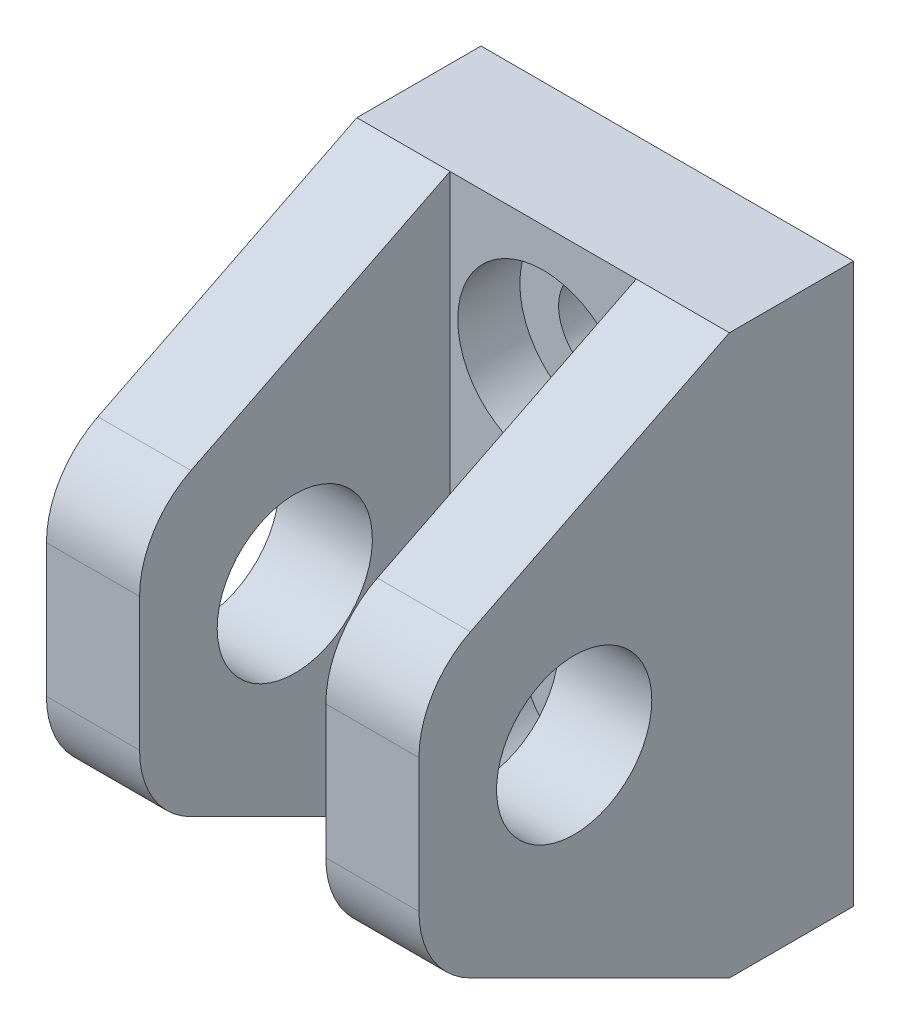
ISO-10303-21;
HEADER;
FILE_DESCRIPTION(('STEP AP214'),'2;1');
FILE_NAME('part.step','',(''),(''),'','','');
FILE_SCHEMA(('AUTOMOTIVE_DESIGN { 1 0 10303 214 1 1 1 1 }'));
ENDSEC;
DATA;
#1=APPLICATION_CONTEXT('core data for automotive mechanical design processes');
#2=APPLICATION_PROTOCOL_DEFINITION('international standard','automotive_design',2000,#1);
#3=PRODUCT_CONTEXT('',#1,'mechanical');
#4=PRODUCT('Part','Part','',(#3));
#5=PRODUCT_RELATED_PRODUCT_CATEGORY('part','',(#4));
#6=PRODUCT_DEFINITION_FORMATION('','',#4);
#7=PRODUCT_DEFINITION_CONTEXT('part definition',#1,'design');
#8=PRODUCT_DEFINITION('design','',#6,#7);
#9=PRODUCT_DEFINITION_SHAPE('','',#8);
#10=(LENGTH_UNIT() NAMED_UNIT(*) SI_UNIT(.MILLI.,.METRE.));
#11=(NAMED_UNIT(*) PLANE_ANGLE_UNIT() SI_UNIT($,.RADIAN.));
#12=(NAMED_UNIT(*) SI_UNIT($,.STERADIAN.) SOLID_ANGLE_UNIT());
#13=UNCERTAINTY_MEASURE_WITH_UNIT(LENGTH_MEASURE(1.E-05),#10,'distance_accuracy_value','');
#14=(GEOMETRIC_REPRESENTATION_CONTEXT(3) GLOBAL_UNCERTAINTY_ASSIGNED_CONTEXT((#13)) GLOBAL_UNIT_ASSIGNED_CONTEXT((#10,
#11,#12)) REPRESENTATION_CONTEXT('',''));
#15=CARTESIAN_POINT('',(0.,0.,0.));
#16=DIRECTION('',(0.,0.,1.));
#17=DIRECTION('',(1.,0.,0.));
#18=AXIS2_PLACEMENT_3D('',#15,#16,#17);
#19=CARTESIAN_POINT('',(10.,4.,0.));
#20=DIRECTION('',(0.,0.,1.));
#21=DIRECTION('',(1.,0.,0.));
#22=AXIS2_PLACEMENT_3D('',#19,#20,#21);
#23=CYLINDRICAL_SURFACE('',#22,1.5);
#24=CARTESIAN_POINT('',(10.,4.,0.));
#25=DIRECTION('',(0.,0.,1.));
#26=DIRECTION('',(1.,0.,0.));
#27=AXIS2_PLACEMENT_3D('',#24,#25,#26);
#28=CIRCLE('',#27,1.5);
#29=CARTESIAN_POINT('',(11.5,4.,0.));
#30=VERTEX_POINT('',#29);
#31=EDGE_CURVE('E208',#30,#30,#28,.T.);
#32=ORIENTED_EDGE('',*,*,#31,.F.);
#33=EDGE_LOOP('',(#32));
#34=FACE_BOUND('',#33,.T.);
#35=CARTESIAN_POINT('',(10.,4.,2.));
#36=DIRECTION('',(0.,0.,1.));
#37=DIRECTION('',(1.,0.,0.));
#38=AXIS2_PLACEMENT_3D('',#35,#36,#37);
#39=CIRCLE('',#38,1.5);
#40=CARTESIAN_POINT('',(11.5,4.,2.));
#41=VERTEX_POINT('',#40);
#42=EDGE_CURVE('E38',#41,#41,#39,.F.);
#43=ORIENTED_EDGE('',*,*,#42,.F.);
#44=EDGE_LOOP('',(#43));
#45=FACE_BOUND('',#44,.T.);
#46=ADVANCED_FACE('F34',(#34,#45),#23,.F.);
#47=CARTESIAN_POINT('',(10.,14.,0.));
#48=DIRECTION('',(0.,0.,1.));
#49=DIRECTION('',(1.,0.,0.));
#50=AXIS2_PLACEMENT_3D('',#47,#48,#49);
#51=CYLINDRICAL_SURFACE('',#50,1.5);
#52=CARTESIAN_POINT('',(10.,14.,0.));
#53=DIRECTION('',(0.,0.,1.));
#54=DIRECTION('',(1.,0.,0.));
#55=AXIS2_PLACEMENT_3D('',#52,#53,#54);
#56=CIRCLE('',#55,1.5);
#57=CARTESIAN_POINT('',(11.5,14.,0.));
#58=VERTEX_POINT('',#57);
#59=EDGE_CURVE('E148',#58,#58,#56,.T.);
#60=ORIENTED_EDGE('',*,*,#59,.F.);
#61=EDGE_LOOP('',(#60));
#62=FACE_BOUND('',#61,.T.);
#63=CARTESIAN_POINT('',(10.,14.,2.));
#64=DIRECTION('',(0.,0.,1.));
#65=DIRECTION('',(1.,0.,0.));
#66=AXIS2_PLACEMENT_3D('',#63,#64,#65);
#67=CIRCLE('',#66,1.5);
#68=CARTESIAN_POINT('',(11.5,14.,2.));
#69=VERTEX_POINT('',#68);
#70=EDGE_CURVE('E206',#69,#69,#67,.F.);
#71=ORIENTED_EDGE('',*,*,#70,.F.);
#72=EDGE_LOOP('',(#71));
#73=FACE_BOUND('',#72,.T.);
#74=ADVANCED_FACE('F332',(#62,#73),#51,.F.);
#75=CARTESIAN_POINT('',(0.,0.,4.));
#76=DIRECTION('',(0.,0.,-1.));
#77=DIRECTION('',(-1.,0.,0.));
#78=AXIS2_PLACEMENT_3D('',#75,#76,#77);
#79=PLANE('',#78);
#80=CARTESIAN_POINT('',(10.,4.,4.));
#81=DIRECTION('',(0.,0.,1.));
#82=DIRECTION('',(1.,0.,0.));
#83=AXIS2_PLACEMENT_3D('',#80,#81,#82);
#84=CIRCLE('',#83,2.75);
#85=CARTESIAN_POINT('',(12.75,4.,4.));
#86=VERTEX_POINT('',#85);
#87=EDGE_CURVE('E222',#86,#86,#84,.T.);
#88=ORIENTED_EDGE('',*,*,#87,.F.);
#89=EDGE_LOOP('',(#88));
#90=FACE_BOUND('',#89,.T.);
#91=CARTESIAN_POINT('',(10.,14.,4.));
#92=DIRECTION('',(0.,0.,1.));
#93=DIRECTION('',(1.,0.,0.));
#94=AXIS2_PLACEMENT_3D('',#91,#92,#93);
#95=CIRCLE('',#94,2.75);
#96=CARTESIAN_POINT('',(12.75,14.,4.));
#97=VERTEX_POINT('',#96);
#98=EDGE_CURVE('E215',#97,#97,#95,.T.);
#99=ORIENTED_EDGE('',*,*,#98,.F.);
#100=EDGE_LOOP('',(#99));
#101=FACE_BOUND('',#100,.T.);
#102=DIRECTION('',(0.,1.,0.));
#103=VECTOR('',#102,1.);
#104=CARTESIAN_POINT('',(7.,0.,4.));
#105=LINE('',#104,#103);
#106=CARTESIAN_POINT('',(7.,0.,4.));
#107=VERTEX_POINT('',#106);
#108=CARTESIAN_POINT('',(7.,18.,4.));
#109=VERTEX_POINT('',#108);
#110=EDGE_CURVE('E267',#107,#109,#105,.T.);
#111=ORIENTED_EDGE('',*,*,#110,.F.);
#112=DIRECTION('',(1.,0.,0.));
#113=VECTOR('',#112,1.);
#114=CARTESIAN_POINT('',(0.,0.,4.));
#115=LINE('',#114,#113);
#116=CARTESIAN_POINT('',(13.,0.,4.));
#117=VERTEX_POINT('',#116);
#118=EDGE_CURVE('E162',#107,#117,#115,.T.);
#119=ORIENTED_EDGE('',*,*,#118,.T.);
#120=DIRECTION('',(0.,-1.,0.));
#121=VECTOR('',#120,1.);
#122=CARTESIAN_POINT('',(13.,0.,4.));
#123=LINE('',#122,#121);
#124=CARTESIAN_POINT('',(13.,18.,4.));
#125=VERTEX_POINT('',#124);
#126=EDGE_CURVE('E274',#125,#117,#123,.T.);
#127=ORIENTED_EDGE('',*,*,#126,.F.);
#128=DIRECTION('',(-1.,0.,0.));
#129=VECTOR('',#128,1.);
#130=CARTESIAN_POINT('',(0.,18.,4.));
#131=LINE('',#130,#129);
#132=EDGE_CURVE('E166',#125,#109,#131,.T.);
#133=ORIENTED_EDGE('',*,*,#132,.T.);
#134=EDGE_LOOP('',(#111,#119,#127,#133));
#135=FACE_BOUND('',#134,.T.);
#136=ADVANCED_FACE('F287',(#90,#101,#135),#79,.F.);
#137=CARTESIAN_POINT('',(0.,0.,4.));
#138=DIRECTION('',(0.,1.,0.));
#139=DIRECTION('',(0.,0.,1.));
#140=AXIS2_PLACEMENT_3D('',#137,#138,#139);
#141=PLANE('',#140);
#142=DIRECTION('',(1.,0.,0.));
#143=VECTOR('',#142,1.);
#144=CARTESIAN_POINT('',(0.,0.,0.));
#145=LINE('',#144,#143);
#146=CARTESIAN_POINT('',(4.,0.,0.));
#147=VERTEX_POINT('',#146);
#148=CARTESIAN_POINT('',(16.,0.,0.));
#149=VERTEX_POINT('',#148);
#150=EDGE_CURVE('E163',#147,#149,#145,.T.);
#151=ORIENTED_EDGE('',*,*,#150,.T.);
#152=DIRECTION('',(0.,0.,1.));
#153=VECTOR('',#152,1.);
#154=CARTESIAN_POINT('',(16.,0.,0.));
#155=LINE('',#154,#153);
#156=CARTESIAN_POINT('',(16.,0.,4.));
#157=VERTEX_POINT('',#156);
#158=EDGE_CURVE('E143',#149,#157,#155,.T.);
#159=ORIENTED_EDGE('',*,*,#158,.T.);
#160=DIRECTION('',(-1.,0.,0.));
#161=VECTOR('',#160,1.);
#162=CARTESIAN_POINT('',(20.,0.,4.));
#163=LINE('',#162,#161);
#164=EDGE_CURVE('E246',#157,#117,#163,.T.);
#165=ORIENTED_EDGE('',*,*,#164,.T.);
#166=ORIENTED_EDGE('',*,*,#118,.F.);
#167=CARTESIAN_POINT('',(4.,0.,4.));
#168=VERTEX_POINT('',#167);
#169=EDGE_CURVE('E243',#107,#168,#163,.T.);
#170=ORIENTED_EDGE('',*,*,#169,.T.);
#171=DIRECTION('',(0.,0.,1.));
#172=VECTOR('',#171,1.);
#173=CARTESIAN_POINT('',(4.,0.,0.));
#174=LINE('',#173,#172);
#175=EDGE_CURVE('E229',#147,#168,#174,.T.);
#176=ORIENTED_EDGE('',*,*,#175,.F.);
#177=EDGE_LOOP('',(#151,#159,#165,#166,#170,#176));
#178=FACE_BOUND('',#177,.T.);
#179=ADVANCED_FACE('F302',(#178),#141,.F.);
#180=CARTESIAN_POINT('',(0.,18.,4.));
#181=DIRECTION('',(0.,-1.,0.));
#182=DIRECTION('',(0.,0.,-1.));
#183=AXIS2_PLACEMENT_3D('',#180,#181,#182);
#184=PLANE('',#183);
#185=DIRECTION('',(-1.,0.,0.));
#186=VECTOR('',#185,1.);
#187=CARTESIAN_POINT('',(20.,18.,4.));
#188=LINE('',#187,#186);
#189=CARTESIAN_POINT('',(16.,18.,4.));
#190=VERTEX_POINT('',#189);
#191=EDGE_CURVE('E157',#190,#125,#188,.T.);
#192=ORIENTED_EDGE('',*,*,#191,.F.);
#193=DIRECTION('',(0.,0.,1.));
#194=VECTOR('',#193,1.);
#195=CARTESIAN_POINT('',(16.,18.,0.));
#196=LINE('',#195,#194);
#197=CARTESIAN_POINT('',(16.,18.,0.));
#198=VERTEX_POINT('',#197);
#199=EDGE_CURVE('E142',#198,#190,#196,.T.);
#200=ORIENTED_EDGE('',*,*,#199,.F.);
#201=DIRECTION('',(-1.,0.,0.));
#202=VECTOR('',#201,1.);
#203=CARTESIAN_POINT('',(0.,18.,0.));
#204=LINE('',#203,#202);
#205=CARTESIAN_POINT('',(4.,18.,0.));
#206=VERTEX_POINT('',#205);
#207=EDGE_CURVE('E153',#198,#206,#204,.T.);
#208=ORIENTED_EDGE('',*,*,#207,.T.);
#209=DIRECTION('',(0.,0.,1.));
#210=VECTOR('',#209,1.);
#211=CARTESIAN_POINT('',(4.,18.,0.));
#212=LINE('',#211,#210);
#213=CARTESIAN_POINT('',(4.,18.,4.));
#214=VERTEX_POINT('',#213);
#215=EDGE_CURVE('E230',#206,#214,#212,.T.);
#216=ORIENTED_EDGE('',*,*,#215,.T.);
#217=EDGE_CURVE('E257',#109,#214,#188,.T.);
#218=ORIENTED_EDGE('',*,*,#217,.F.);
#219=ORIENTED_EDGE('',*,*,#132,.F.);
#220=EDGE_LOOP('',(#192,#200,#208,#216,#218,#219));
#221=FACE_BOUND('',#220,.T.);
#222=ADVANCED_FACE('F152',(#221),#184,.F.);
#223=CARTESIAN_POINT('',(0.,0.,0.));
#224=DIRECTION('',(0.,0.,-1.));
#225=DIRECTION('',(-1.,0.,0.));
#226=AXIS2_PLACEMENT_3D('',#223,#224,#225);
#227=PLANE('',#226);
#228=ORIENTED_EDGE('',*,*,#31,.T.);
#229=EDGE_LOOP('',(#228));
#230=FACE_BOUND('',#229,.T.);
#231=ORIENTED_EDGE('',*,*,#59,.T.);
#232=EDGE_LOOP('',(#231));
#233=FACE_BOUND('',#232,.T.);
#234=DIRECTION('',(0.,-1.,0.));
#235=VECTOR('',#234,1.);
#236=CARTESIAN_POINT('',(16.,18.,0.));
#237=LINE('',#236,#235);
#238=EDGE_CURVE('E139',#198,#149,#237,.T.);
#239=ORIENTED_EDGE('',*,*,#238,.T.);
#240=ORIENTED_EDGE('',*,*,#150,.F.);
#241=DIRECTION('',(0.,1.,0.));
#242=VECTOR('',#241,1.);
#243=CARTESIAN_POINT('',(4.,0.,0.));
#244=LINE('',#243,#242);
#245=EDGE_CURVE('E161',#147,#206,#244,.T.);
#246=ORIENTED_EDGE('',*,*,#245,.T.);
#247=ORIENTED_EDGE('',*,*,#207,.F.);
#248=EDGE_LOOP('',(#239,#240,#246,#247));
#249=FACE_BOUND('',#248,.T.);
#250=ADVANCED_FACE('F160',(#230,#233,#249),#227,.T.);
#251=CARTESIAN_POINT('',(16.,0.,14.));
#252=DIRECTION('',(-1.,0.,0.));
#253=DIRECTION('',(0.,0.,1.));
#254=AXIS2_PLACEMENT_3D('',#251,#252,#253);
#255=PLANE('',#254);
#256=CARTESIAN_POINT('',(16.,9.,9.));
#257=DIRECTION('',(1.,0.,0.));
#258=DIRECTION('',(0.,0.,-1.));
#259=AXIS2_PLACEMENT_3D('',#256,#257,#258);
#260=CIRCLE('',#259,2.5);
#261=CARTESIAN_POINT('',(16.,9.,6.5));
#262=VERTEX_POINT('',#261);
#263=EDGE_CURVE('E176',#262,#262,#260,.T.);
#264=ORIENTED_EDGE('',*,*,#263,.F.);
#265=EDGE_LOOP('',(#264));
#266=FACE_BOUND('',#265,.T.);
#267=DIRECTION('',(0.,-0.447213595499958,0.894427190999916));
#268=VECTOR('',#267,1.);
#269=CARTESIAN_POINT('',(16.,10.4,19.2));
#270=LINE('',#269,#268);
#271=CARTESIAN_POINT('',(16.,13.8291796067501,12.3416407864999));
#272=VERTEX_POINT('',#271);
#273=EDGE_CURVE('E265',#190,#272,#270,.T.);
#274=ORIENTED_EDGE('',*,*,#273,.T.);
#275=CARTESIAN_POINT('',(16.,11.1458980337503,11.));
#276=DIRECTION('',(-1.,0.,0.));
#277=DIRECTION('',(0.,0.,1.));
#278=AXIS2_PLACEMENT_3D('',#275,#276,#277);
#279=CIRCLE('',#278,3.);
#280=CARTESIAN_POINT('',(16.,11.1458980337503,14.));
#281=VERTEX_POINT('',#280);
#282=EDGE_CURVE('E203',#272,#281,#279,.F.);
#283=ORIENTED_EDGE('',*,*,#282,.T.);
#284=DIRECTION('',(0.,1.,0.));
#285=VECTOR('',#284,1.);
#286=CARTESIAN_POINT('',(16.,0.,14.));
#287=LINE('',#286,#285);
#288=CARTESIAN_POINT('',(16.,6.85410196624968,14.));
#289=VERTEX_POINT('',#288);
#290=EDGE_CURVE('E277',#289,#281,#287,.T.);
#291=ORIENTED_EDGE('',*,*,#290,.F.);
#292=CARTESIAN_POINT('',(16.,6.85410196624968,11.));
#293=DIRECTION('',(-1.,0.,0.));
#294=DIRECTION('',(0.,0.,1.));
#295=AXIS2_PLACEMENT_3D('',#292,#293,#294);
#296=CIRCLE('',#295,3.);
#297=CARTESIAN_POINT('',(16.,4.17082039324994,12.3416407864999));
#298=VERTEX_POINT('',#297);
#299=EDGE_CURVE('E51',#289,#298,#296,.F.);
#300=ORIENTED_EDGE('',*,*,#299,.T.);
#301=DIRECTION('',(0.,-0.447213595499958,-0.894427190999916));
#302=VECTOR('',#301,1.);
#303=CARTESIAN_POINT('',(16.,4.,12.));
#304=LINE('',#303,#302);
#305=EDGE_CURVE('E252',#298,#157,#304,.T.);
#306=ORIENTED_EDGE('',*,*,#305,.T.);
#307=ORIENTED_EDGE('',*,*,#158,.F.);
#308=ORIENTED_EDGE('',*,*,#238,.F.);
#309=ORIENTED_EDGE('',*,*,#199,.T.);
#310=EDGE_LOOP('',(#274,#283,#291,#300,#306,#307,#308,#309));
#311=FACE_BOUND('',#310,.T.);
#312=ADVANCED_FACE('F141',(#266,#311),#255,.F.);
#313=CARTESIAN_POINT('',(13.,0.,14.));
#314=DIRECTION('',(1.,0.,0.));
#315=DIRECTION('',(0.,0.,-1.));
#316=AXIS2_PLACEMENT_3D('',#313,#314,#315);
#317=PLANE('',#316);
#318=CARTESIAN_POINT('',(13.,9.,9.));
#319=DIRECTION('',(1.,0.,0.));
#320=DIRECTION('',(0.,0.,-1.));
#321=AXIS2_PLACEMENT_3D('',#318,#319,#320);
#322=CIRCLE('',#321,2.5);
#323=CARTESIAN_POINT('',(13.,9.,6.5));
#324=VERTEX_POINT('',#323);
#325=EDGE_CURVE('E237',#324,#324,#322,.T.);
#326=ORIENTED_EDGE('',*,*,#325,.T.);
#327=EDGE_LOOP('',(#326));
#328=FACE_BOUND('',#327,.T.);
#329=DIRECTION('',(0.,-1.,0.));
#330=VECTOR('',#329,1.);
#331=CARTESIAN_POINT('',(13.,0.,14.));
#332=LINE('',#331,#330);
#333=CARTESIAN_POINT('',(13.,11.1458980337503,14.));
#334=VERTEX_POINT('',#333);
#335=CARTESIAN_POINT('',(13.,6.85410196624968,14.));
#336=VERTEX_POINT('',#335);
#337=EDGE_CURVE('E168',#334,#336,#332,.T.);
#338=ORIENTED_EDGE('',*,*,#337,.F.);
#339=CARTESIAN_POINT('',(13.,11.1458980337503,11.));
#340=DIRECTION('',(1.,0.,0.));
#341=DIRECTION('',(0.,0.,-1.));
#342=AXIS2_PLACEMENT_3D('',#339,#340,#341);
#343=CIRCLE('',#342,3.);
#344=CARTESIAN_POINT('',(13.,13.8291796067501,12.3416407864999));
#345=VERTEX_POINT('',#344);
#346=EDGE_CURVE('E199',#334,#345,#343,.F.);
#347=ORIENTED_EDGE('',*,*,#346,.T.);
#348=DIRECTION('',(0.,0.447213595499958,-0.894427190999916));
#349=VECTOR('',#348,1.);
#350=CARTESIAN_POINT('',(13.,10.4,19.2));
#351=LINE('',#350,#349);
#352=EDGE_CURVE('E263',#345,#125,#351,.T.);
#353=ORIENTED_EDGE('',*,*,#352,.T.);
#354=ORIENTED_EDGE('',*,*,#126,.T.);
#355=DIRECTION('',(0.,0.447213595499958,0.894427190999916));
#356=VECTOR('',#355,1.);
#357=CARTESIAN_POINT('',(13.,4.,12.));
#358=LINE('',#357,#356);
#359=CARTESIAN_POINT('',(13.,4.17082039324994,12.3416407864999));
#360=VERTEX_POINT('',#359);
#361=EDGE_CURVE('E249',#117,#360,#358,.T.);
#362=ORIENTED_EDGE('',*,*,#361,.T.);
#363=CARTESIAN_POINT('',(13.,6.85410196624968,11.));
#364=DIRECTION('',(1.,0.,0.));
#365=DIRECTION('',(0.,0.,-1.));
#366=AXIS2_PLACEMENT_3D('',#363,#364,#365);
#367=CIRCLE('',#366,3.);
#368=EDGE_CURVE('E197',#360,#336,#367,.F.);
#369=ORIENTED_EDGE('',*,*,#368,.T.);
#370=EDGE_LOOP('',(#338,#347,#353,#354,#362,#369));
#371=FACE_BOUND('',#370,.T.);
#372=ADVANCED_FACE('F307',(#328,#371),#317,.F.);
#373=CARTESIAN_POINT('',(0.,0.,14.));
#374=DIRECTION('',(0.,0.,1.));
#375=DIRECTION('',(1.,0.,0.));
#376=AXIS2_PLACEMENT_3D('',#373,#374,#375);
#377=PLANE('',#376);
#378=ORIENTED_EDGE('',*,*,#290,.T.);
#379=DIRECTION('',(-1.,0.,0.));
#380=VECTOR('',#379,1.);
#381=CARTESIAN_POINT('',(13.,11.1458980337503,14.));
#382=LINE('',#381,#380);
#383=EDGE_CURVE('E194',#281,#334,#382,.T.);
#384=ORIENTED_EDGE('',*,*,#383,.T.);
#385=ORIENTED_EDGE('',*,*,#337,.T.);
#386=DIRECTION('',(-1.,0.,0.));
#387=VECTOR('',#386,1.);
#388=CARTESIAN_POINT('',(16.,6.85410196624968,14.));
#389=LINE('',#388,#387);
#390=EDGE_CURVE('E192',#336,#289,#389,.F.);
#391=ORIENTED_EDGE('',*,*,#390,.T.);
#392=EDGE_LOOP('',(#378,#384,#385,#391));
#393=FACE_BOUND('',#392,.T.);
#394=ADVANCED_FACE('F314',(#393),#377,.T.);
#395=CARTESIAN_POINT('',(7.,0.,14.));
#396=DIRECTION('',(-1.,0.,0.));
#397=DIRECTION('',(0.,0.,1.));
#398=AXIS2_PLACEMENT_3D('',#395,#396,#397);
#399=PLANE('',#398);
#400=CARTESIAN_POINT('',(7.,9.,9.));
#401=DIRECTION('',(-1.,0.,0.));
#402=DIRECTION('',(0.,0.,1.));
#403=AXIS2_PLACEMENT_3D('',#400,#401,#402);
#404=CIRCLE('',#403,2.5);
#405=CARTESIAN_POINT('',(7.,9.,11.5));
#406=VERTEX_POINT('',#405);
#407=EDGE_CURVE('E175',#406,#406,#404,.T.);
#408=ORIENTED_EDGE('',*,*,#407,.T.);
#409=EDGE_LOOP('',(#408));
#410=FACE_BOUND('',#409,.T.);
#411=DIRECTION('',(0.,-0.447213595499958,0.894427190999916));
#412=VECTOR('',#411,1.);
#413=CARTESIAN_POINT('',(7.,10.4,19.2));
#414=LINE('',#413,#412);
#415=CARTESIAN_POINT('',(7.,13.8291796067501,12.3416407864999));
#416=VERTEX_POINT('',#415);
#417=EDGE_CURVE('E260',#109,#416,#414,.T.);
#418=ORIENTED_EDGE('',*,*,#417,.T.);
#419=CARTESIAN_POINT('',(7.,11.1458980337503,11.));
#420=DIRECTION('',(-1.,0.,0.));
#421=DIRECTION('',(0.,0.,1.));
#422=AXIS2_PLACEMENT_3D('',#419,#420,#421);
#423=CIRCLE('',#422,3.);
#424=CARTESIAN_POINT('',(7.,11.1458980337503,14.));
#425=VERTEX_POINT('',#424);
#426=EDGE_CURVE('E182',#416,#425,#423,.F.);
#427=ORIENTED_EDGE('',*,*,#426,.T.);
#428=DIRECTION('',(0.,1.,0.));
#429=VECTOR('',#428,1.);
#430=CARTESIAN_POINT('',(7.,0.,14.));
#431=LINE('',#430,#429);
#432=CARTESIAN_POINT('',(7.,6.85410196624968,14.));
#433=VERTEX_POINT('',#432);
#434=EDGE_CURVE('E268',#433,#425,#431,.T.);
#435=ORIENTED_EDGE('',*,*,#434,.F.);
#436=CARTESIAN_POINT('',(7.,6.85410196624968,11.));
#437=DIRECTION('',(-1.,0.,0.));
#438=DIRECTION('',(0.,0.,1.));
#439=AXIS2_PLACEMENT_3D('',#436,#437,#438);
#440=CIRCLE('',#439,3.);
#441=CARTESIAN_POINT('',(7.,4.17082039324994,12.3416407864999));
#442=VERTEX_POINT('',#441);
#443=EDGE_CURVE('E180',#433,#442,#440,.F.);
#444=ORIENTED_EDGE('',*,*,#443,.T.);
#445=DIRECTION('',(0.,-0.447213595499958,-0.894427190999916));
#446=VECTOR('',#445,1.);
#447=CARTESIAN_POINT('',(7.,4.,12.));
#448=LINE('',#447,#446);
#449=EDGE_CURVE('E247',#442,#107,#448,.T.);
#450=ORIENTED_EDGE('',*,*,#449,.T.);
#451=ORIENTED_EDGE('',*,*,#110,.T.);
#452=EDGE_LOOP('',(#418,#427,#435,#444,#450,#451));
#453=FACE_BOUND('',#452,.T.);
#454=ADVANCED_FACE('F291',(#410,#453),#399,.F.);
#455=CARTESIAN_POINT('',(4.,0.,14.));
#456=DIRECTION('',(1.,0.,0.));
#457=DIRECTION('',(0.,1.,0.));
#458=AXIS2_PLACEMENT_3D('',#455,#456,#457);
#459=PLANE('',#458);
#460=CARTESIAN_POINT('',(4.,9.,9.));
#461=DIRECTION('',(1.,0.,0.));
#462=DIRECTION('',(0.,1.,0.));
#463=AXIS2_PLACEMENT_3D('',#460,#461,#462);
#464=CIRCLE('',#463,2.5);
#465=CARTESIAN_POINT('',(4.,11.5,9.));
#466=VERTEX_POINT('',#465);
#467=EDGE_CURVE('E172',#466,#466,#464,.T.);
#468=ORIENTED_EDGE('',*,*,#467,.T.);
#469=EDGE_LOOP('',(#468));
#470=FACE_BOUND('',#469,.T.);
#471=DIRECTION('',(0.,-1.,0.));
#472=VECTOR('',#471,1.);
#473=CARTESIAN_POINT('',(4.,0.,14.));
#474=LINE('',#473,#472);
#475=CARTESIAN_POINT('',(4.,11.1458980337503,14.));
#476=VERTEX_POINT('',#475);
#477=CARTESIAN_POINT('',(4.,6.85410196624968,14.));
#478=VERTEX_POINT('',#477);
#479=EDGE_CURVE('E271',#476,#478,#474,.T.);
#480=ORIENTED_EDGE('',*,*,#479,.F.);
#481=CARTESIAN_POINT('',(4.,11.1458980337503,11.));
#482=DIRECTION('',(1.,0.,0.));
#483=DIRECTION('',(0.,1.,0.));
#484=AXIS2_PLACEMENT_3D('',#481,#482,#483);
#485=CIRCLE('',#484,3.);
#486=CARTESIAN_POINT('',(4.,13.8291796067501,12.3416407864999));
#487=VERTEX_POINT('',#486);
#488=EDGE_CURVE('E190',#476,#487,#485,.F.);
#489=ORIENTED_EDGE('',*,*,#488,.T.);
#490=DIRECTION('',(0.,-0.447213595499958,0.894427190999916));
#491=VECTOR('',#490,1.);
#492=CARTESIAN_POINT('',(4.,18.,4.));
#493=LINE('',#492,#491);
#494=EDGE_CURVE('E254',#214,#487,#493,.T.);
#495=ORIENTED_EDGE('',*,*,#494,.F.);
#496=ORIENTED_EDGE('',*,*,#215,.F.);
#497=ORIENTED_EDGE('',*,*,#245,.F.);
#498=ORIENTED_EDGE('',*,*,#175,.T.);
#499=DIRECTION('',(0.,-0.447213595499958,-0.894427190999916));
#500=VECTOR('',#499,1.);
#501=CARTESIAN_POINT('',(4.,0.,4.));
#502=LINE('',#501,#500);
#503=CARTESIAN_POINT('',(4.,4.17082039324994,12.3416407864999));
#504=VERTEX_POINT('',#503);
#505=EDGE_CURVE('E240',#504,#168,#502,.T.);
#506=ORIENTED_EDGE('',*,*,#505,.F.);
#507=CARTESIAN_POINT('',(4.,6.85410196624968,11.));
#508=DIRECTION('',(1.,0.,0.));
#509=DIRECTION('',(0.,1.,0.));
#510=AXIS2_PLACEMENT_3D('',#507,#508,#509);
#511=CIRCLE('',#510,3.);
#512=EDGE_CURVE('E188',#504,#478,#511,.F.);
#513=ORIENTED_EDGE('',*,*,#512,.T.);
#514=EDGE_LOOP('',(#480,#489,#495,#496,#497,#498,#506,#513));
#515=FACE_BOUND('',#514,.T.);
#516=ADVANCED_FACE('F389',(#470,#515),#459,.F.);
#517=CARTESIAN_POINT('',(0.,0.,14.));
#518=DIRECTION('',(0.,0.,1.));
#519=DIRECTION('',(1.,0.,0.));
#520=AXIS2_PLACEMENT_3D('',#517,#518,#519);
#521=PLANE('',#520);
#522=ORIENTED_EDGE('',*,*,#434,.T.);
#523=DIRECTION('',(1.,0.,0.));
#524=VECTOR('',#523,1.);
#525=CARTESIAN_POINT('',(4.,11.1458980337503,14.));
#526=LINE('',#525,#524);
#527=EDGE_CURVE('E186',#425,#476,#526,.F.);
#528=ORIENTED_EDGE('',*,*,#527,.T.);
#529=ORIENTED_EDGE('',*,*,#479,.T.);
#530=DIRECTION('',(-1.,0.,0.));
#531=VECTOR('',#530,1.);
#532=CARTESIAN_POINT('',(7.,6.85410196624968,14.));
#533=LINE('',#532,#531);
#534=EDGE_CURVE('E184',#478,#433,#533,.F.);
#535=ORIENTED_EDGE('',*,*,#534,.T.);
#536=EDGE_LOOP('',(#522,#528,#529,#535));
#537=FACE_BOUND('',#536,.T.);
#538=ADVANCED_FACE('F397',(#537),#521,.T.);
#539=CARTESIAN_POINT('',(20.,18.,4.));
#540=DIRECTION('',(0.,-0.894427190999916,-0.447213595499958));
#541=DIRECTION('',(0.,0.447213595499958,-0.894427190999916));
#542=AXIS2_PLACEMENT_3D('',#539,#540,#541);
#543=PLANE('',#542);
#544=ORIENTED_EDGE('',*,*,#494,.T.);
#545=DIRECTION('',(1.,0.,0.));
#546=VECTOR('',#545,1.);
#547=CARTESIAN_POINT('',(7.,13.8291796067501,12.3416407864999));
#548=LINE('',#547,#546);
#549=EDGE_CURVE('E177',#487,#416,#548,.T.);
#550=ORIENTED_EDGE('',*,*,#549,.T.);
#551=ORIENTED_EDGE('',*,*,#417,.F.);
#552=ORIENTED_EDGE('',*,*,#217,.T.);
#553=EDGE_LOOP('',(#544,#550,#551,#552));
#554=FACE_BOUND('',#553,.T.);
#555=ADVANCED_FACE('F392',(#554),#543,.F.);
#556=ORIENTED_EDGE('',*,*,#352,.F.);
#557=DIRECTION('',(-1.,0.,0.));
#558=VECTOR('',#557,1.);
#559=CARTESIAN_POINT('',(16.,13.8291796067501,12.3416407864999));
#560=LINE('',#559,#558);
#561=EDGE_CURVE('E59',#345,#272,#560,.F.);
#562=ORIENTED_EDGE('',*,*,#561,.T.);
#563=ORIENTED_EDGE('',*,*,#273,.F.);
#564=ORIENTED_EDGE('',*,*,#191,.T.);
#565=EDGE_LOOP('',(#556,#562,#563,#564));
#566=FACE_BOUND('',#565,.T.);
#567=ADVANCED_FACE('F308',(#566),#543,.F.);
#568=CARTESIAN_POINT('',(20.,0.,4.));
#569=DIRECTION('',(0.,0.894427190999916,-0.447213595499958));
#570=DIRECTION('',(0.,0.447213595499958,0.894427190999916));
#571=AXIS2_PLACEMENT_3D('',#568,#569,#570);
#572=PLANE('',#571);
#573=ORIENTED_EDGE('',*,*,#449,.F.);
#574=DIRECTION('',(-1.,0.,0.));
#575=VECTOR('',#574,1.);
#576=CARTESIAN_POINT('',(4.,4.17082039324994,12.3416407864999));
#577=LINE('',#576,#575);
#578=EDGE_CURVE('E43',#442,#504,#577,.T.);
#579=ORIENTED_EDGE('',*,*,#578,.T.);
#580=ORIENTED_EDGE('',*,*,#505,.T.);
#581=ORIENTED_EDGE('',*,*,#169,.F.);
#582=EDGE_LOOP('',(#573,#579,#580,#581));
#583=FACE_BOUND('',#582,.T.);
#584=ADVANCED_FACE('F298',(#583),#572,.F.);
#585=ORIENTED_EDGE('',*,*,#305,.F.);
#586=DIRECTION('',(-1.,0.,0.));
#587=VECTOR('',#586,1.);
#588=CARTESIAN_POINT('',(13.,4.17082039324994,12.3416407864999));
#589=LINE('',#588,#587);
#590=EDGE_CURVE('E11',#298,#360,#589,.T.);
#591=ORIENTED_EDGE('',*,*,#590,.T.);
#592=ORIENTED_EDGE('',*,*,#361,.F.);
#593=ORIENTED_EDGE('',*,*,#164,.F.);
#594=EDGE_LOOP('',(#585,#591,#592,#593));
#595=FACE_BOUND('',#594,.T.);
#596=ADVANCED_FACE('F319',(#595),#572,.F.);
#597=CARTESIAN_POINT('',(0.,9.,9.));
#598=DIRECTION('',(1.,0.,0.));
#599=DIRECTION('',(0.,0.,-1.));
#600=AXIS2_PLACEMENT_3D('',#597,#598,#599);
#601=CYLINDRICAL_SURFACE('',#600,2.5);
#602=ORIENTED_EDGE('',*,*,#467,.F.);
#603=EDGE_LOOP('',(#602));
#604=FACE_BOUND('',#603,.T.);
#605=ORIENTED_EDGE('',*,*,#407,.F.);
#606=EDGE_LOOP('',(#605));
#607=FACE_BOUND('',#606,.T.);
#608=ADVANCED_FACE('F321',(#604,#607),#601,.F.);
#609=ORIENTED_EDGE('',*,*,#263,.T.);
#610=EDGE_LOOP('',(#609));
#611=FACE_BOUND('',#610,.T.);
#612=ORIENTED_EDGE('',*,*,#325,.F.);
#613=EDGE_LOOP('',(#612));
#614=FACE_BOUND('',#613,.T.);
#615=ADVANCED_FACE('F327',(#611,#614),#601,.F.);
#616=CARTESIAN_POINT('',(20.,11.1458980337503,11.));
#617=DIRECTION('',(-1.,0.,0.));
#618=DIRECTION('',(0.,-1.,0.));
#619=AXIS2_PLACEMENT_3D('',#616,#617,#618);
#620=CYLINDRICAL_SURFACE('',#619,3.);
#621=ORIENTED_EDGE('',*,*,#488,.F.);
#622=ORIENTED_EDGE('',*,*,#527,.F.);
#623=ORIENTED_EDGE('',*,*,#426,.F.);
#624=ORIENTED_EDGE('',*,*,#549,.F.);
#625=EDGE_LOOP('',(#621,#622,#623,#624));
#626=FACE_BOUND('',#625,.T.);
#627=ADVANCED_FACE('F346',(#626),#620,.T.);
#628=CARTESIAN_POINT('',(0.,11.1458980337503,11.));
#629=DIRECTION('',(1.,0.,0.));
#630=DIRECTION('',(0.,1.,0.));
#631=AXIS2_PLACEMENT_3D('',#628,#629,#630);
#632=CYLINDRICAL_SURFACE('',#631,3.);
#633=ORIENTED_EDGE('',*,*,#282,.F.);
#634=ORIENTED_EDGE('',*,*,#561,.F.);
#635=ORIENTED_EDGE('',*,*,#346,.F.);
#636=ORIENTED_EDGE('',*,*,#383,.F.);
#637=EDGE_LOOP('',(#633,#634,#635,#636));
#638=FACE_BOUND('',#637,.T.);
#639=ADVANCED_FACE('F312',(#638),#632,.T.);
#640=CARTESIAN_POINT('',(20.,6.85410196624968,11.));
#641=DIRECTION('',(1.,0.,0.));
#642=DIRECTION('',(0.,1.,0.));
#643=AXIS2_PLACEMENT_3D('',#640,#641,#642);
#644=CYLINDRICAL_SURFACE('',#643,3.);
#645=ORIENTED_EDGE('',*,*,#443,.F.);
#646=ORIENTED_EDGE('',*,*,#534,.F.);
#647=ORIENTED_EDGE('',*,*,#512,.F.);
#648=ORIENTED_EDGE('',*,*,#578,.F.);
#649=EDGE_LOOP('',(#645,#646,#647,#648));
#650=FACE_BOUND('',#649,.T.);
#651=ADVANCED_FACE('F379',(#650),#644,.T.);
#652=CARTESIAN_POINT('',(20.,6.85410196624968,11.));
#653=DIRECTION('',(1.,0.,0.));
#654=DIRECTION('',(0.,1.,0.));
#655=AXIS2_PLACEMENT_3D('',#652,#653,#654);
#656=CYLINDRICAL_SURFACE('',#655,3.);
#657=ORIENTED_EDGE('',*,*,#299,.F.);
#658=ORIENTED_EDGE('',*,*,#390,.F.);
#659=ORIENTED_EDGE('',*,*,#368,.F.);
#660=ORIENTED_EDGE('',*,*,#590,.F.);
#661=EDGE_LOOP('',(#657,#658,#659,#660));
#662=FACE_BOUND('',#661,.T.);
#663=ADVANCED_FACE('F36',(#662),#656,.T.);
#664=CARTESIAN_POINT('',(10.,14.,2.));
#665=DIRECTION('',(0.,0.,1.));
#666=DIRECTION('',(1.,0.,0.));
#667=AXIS2_PLACEMENT_3D('',#664,#665,#666);
#668=PLANE('',#667);
#669=CARTESIAN_POINT('',(10.,14.,2.));
#670=DIRECTION('',(0.,0.,1.));
#671=DIRECTION('',(1.,0.,0.));
#672=AXIS2_PLACEMENT_3D('',#669,#670,#671);
#673=CIRCLE('',#672,2.75);
#674=CARTESIAN_POINT('',(12.75,14.,2.));
#675=VERTEX_POINT('',#674);
#676=EDGE_CURVE('E209',#675,#675,#673,.T.);
#677=ORIENTED_EDGE('',*,*,#676,.T.);
#678=EDGE_LOOP('',(#677));
#679=FACE_BOUND('',#678,.T.);
#680=ORIENTED_EDGE('',*,*,#70,.T.);
#681=EDGE_LOOP('',(#680));
#682=FACE_BOUND('',#681,.T.);
#683=ADVANCED_FACE('F385',(#679,#682),#668,.T.);
#684=CARTESIAN_POINT('',(10.,14.,2.));
#685=DIRECTION('',(0.,0.,1.));
#686=DIRECTION('',(1.,0.,0.));
#687=AXIS2_PLACEMENT_3D('',#684,#685,#686);
#688=CYLINDRICAL_SURFACE('',#687,2.75);
#689=ORIENTED_EDGE('',*,*,#676,.F.);
#690=EDGE_LOOP('',(#689));
#691=FACE_BOUND('',#690,.T.);
#692=ORIENTED_EDGE('',*,*,#98,.T.);
#693=EDGE_LOOP('',(#692));
#694=FACE_BOUND('',#693,.T.);
#695=ADVANCED_FACE('F343',(#691,#694),#688,.F.);
#696=CARTESIAN_POINT('',(10.,4.,2.));
#697=DIRECTION('',(0.,0.,1.));
#698=DIRECTION('',(1.,0.,0.));
#699=AXIS2_PLACEMENT_3D('',#696,#697,#698);
#700=PLANE('',#699);
#701=CARTESIAN_POINT('',(10.,4.,2.));
#702=DIRECTION('',(0.,0.,1.));
#703=DIRECTION('',(1.,0.,0.));
#704=AXIS2_PLACEMENT_3D('',#701,#702,#703);
#705=CIRCLE('',#704,2.75);
#706=CARTESIAN_POINT('',(12.75,4.,2.));
#707=VERTEX_POINT('',#706);
#708=EDGE_CURVE('E533',#707,#707,#705,.T.);
#709=ORIENTED_EDGE('',*,*,#708,.T.);
#710=EDGE_LOOP('',(#709));
#711=FACE_BOUND('',#710,.T.);
#712=ORIENTED_EDGE('',*,*,#42,.T.);
#713=EDGE_LOOP('',(#712));
#714=FACE_BOUND('',#713,.T.);
#715=ADVANCED_FACE('F507',(#711,#714),#700,.T.);
#716=CARTESIAN_POINT('',(10.,4.,2.));
#717=DIRECTION('',(0.,0.,1.));
#718=DIRECTION('',(1.,0.,0.));
#719=AXIS2_PLACEMENT_3D('',#716,#717,#718);
#720=CYLINDRICAL_SURFACE('',#719,2.75);
#721=ORIENTED_EDGE('',*,*,#708,.F.);
#722=EDGE_LOOP('',(#721));
#723=FACE_BOUND('',#722,.T.);
#724=ORIENTED_EDGE('',*,*,#87,.T.);
#725=EDGE_LOOP('',(#724));
#726=FACE_BOUND('',#725,.T.);
#727=ADVANCED_FACE('F516',(#723,#726),#720,.F.);
#728=CLOSED_SHELL('',(#46,#74,#136,#179,#222,#250,#312,#372,#394,#454,#516,#538,#555,#567,#584,
#596,#608,#615,#627,#639,#651,#663,#683,#695,#715,#727));
#729=MANIFOLD_SOLID_BREP('B2',#728);
#730=ADVANCED_BREP_SHAPE_REPRESENTATION('',(#18,#729),#14);
#731=SHAPE_DEFINITION_REPRESENTATION(#9,#730);
ENDSEC;
END-ISO-10303-21;
